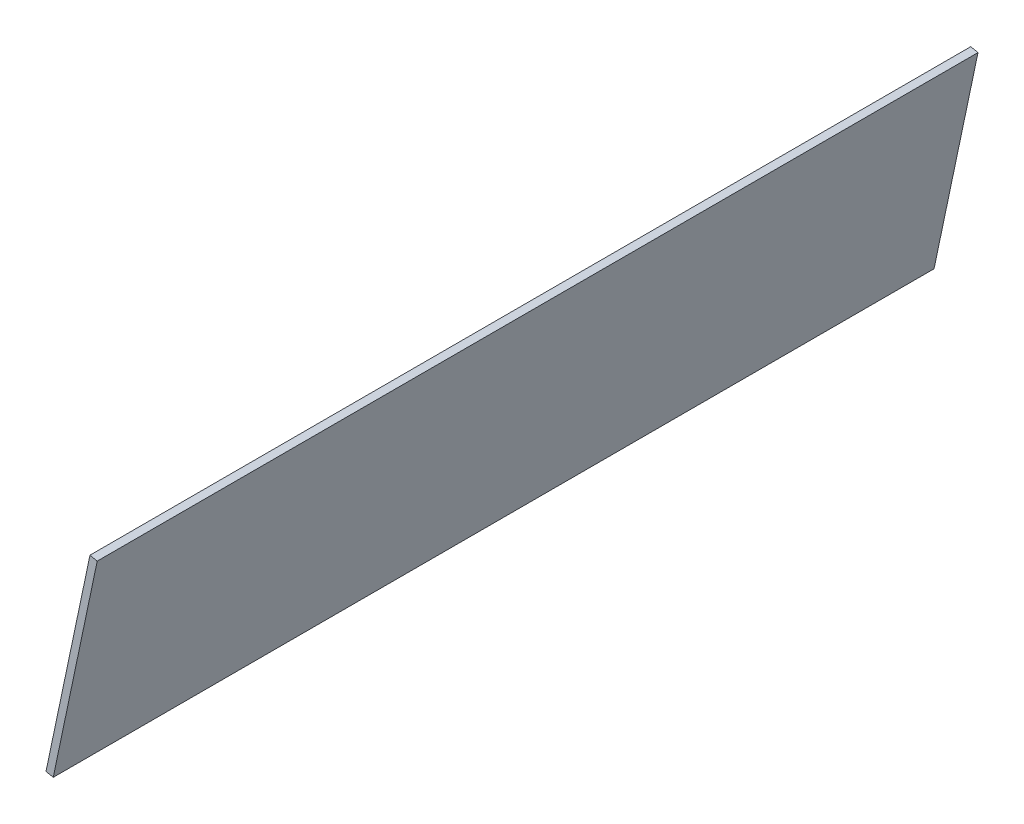
ISO-10303-21;
HEADER;
FILE_DESCRIPTION(('STEP AP214'),'2;1');
FILE_NAME('part.step','',(''),(''),'','','');
FILE_SCHEMA(('AUTOMOTIVE_DESIGN { 1 0 10303 214 1 1 1 1 }'));
ENDSEC;
DATA;
#1=APPLICATION_CONTEXT('core data for automotive mechanical design processes');
#2=APPLICATION_PROTOCOL_DEFINITION('international standard','automotive_design',2000,#1);
#3=PRODUCT_CONTEXT('',#1,'mechanical');
#4=PRODUCT('Part','Part','',(#3));
#5=PRODUCT_RELATED_PRODUCT_CATEGORY('part','',(#4));
#6=PRODUCT_DEFINITION_FORMATION('','',#4);
#7=PRODUCT_DEFINITION_CONTEXT('part definition',#1,'design');
#8=PRODUCT_DEFINITION('design','',#6,#7);
#9=PRODUCT_DEFINITION_SHAPE('','',#8);
#10=(LENGTH_UNIT() NAMED_UNIT(*) SI_UNIT(.MILLI.,.METRE.));
#11=(NAMED_UNIT(*) PLANE_ANGLE_UNIT() SI_UNIT($,.RADIAN.));
#12=(NAMED_UNIT(*) SI_UNIT($,.STERADIAN.) SOLID_ANGLE_UNIT());
#13=UNCERTAINTY_MEASURE_WITH_UNIT(LENGTH_MEASURE(1.E-05),#10,'distance_accuracy_value','');
#14=(GEOMETRIC_REPRESENTATION_CONTEXT(3) GLOBAL_UNCERTAINTY_ASSIGNED_CONTEXT((#13)) GLOBAL_UNIT_ASSIGNED_CONTEXT((#10,
#11,#12)) REPRESENTATION_CONTEXT('',''));
#15=CARTESIAN_POINT('',(0.,0.,0.));
#16=DIRECTION('',(0.,0.,1.));
#17=DIRECTION('',(1.,0.,0.));
#18=AXIS2_PLACEMENT_3D('',#15,#16,#17);
#19=CARTESIAN_POINT('',(0.,0.,0.));
#20=DIRECTION('',(0.,0.,1.));
#21=DIRECTION('',(1.,0.,0.));
#22=AXIS2_PLACEMENT_3D('',#19,#20,#21);
#23=PLANE('',#22);
#24=DIRECTION('',(0.978627227397066,-0.205642286014163,0.));
#25=VECTOR('',#24,1.);
#26=CARTESIAN_POINT('',(24.2240089882818,-184.530911804715,0.));
#27=LINE('',#26,#25);
#28=CARTESIAN_POINT('',(24.2240089882818,-184.530911804715,0.));
#29=VERTEX_POINT('',#28);
#30=CARTESIAN_POINT('',(27.4534788386921,-185.209531348562,0.));
#31=VERTEX_POINT('',#30);
#32=EDGE_CURVE('E85',#29,#31,#27,.T.);
#33=ORIENTED_EDGE('',*,*,#32,.F.);
#34=DIRECTION('',(-0.205642286014167,-0.978627227397065,0.));
#35=VECTOR('',#34,1.);
#36=CARTESIAN_POINT('',(24.2240089882818,-184.530911804715,0.));
#37=LINE('',#36,#35);
#38=CARTESIAN_POINT('',(43.8641091012227,-91.0660068386027,0.));
#39=VERTEX_POINT('',#38);
#40=EDGE_CURVE('E96',#39,#29,#37,.T.);
#41=ORIENTED_EDGE('',*,*,#40,.F.);
#42=DIRECTION('',(-0.978627227397067,0.205642286014161,0.));
#43=VECTOR('',#42,1.);
#44=CARTESIAN_POINT('',(47.0935789516329,-91.7446263824494,0.));
#45=LINE('',#44,#43);
#46=CARTESIAN_POINT('',(47.0935789516329,-91.7446263824494,0.));
#47=VERTEX_POINT('',#46);
#48=EDGE_CURVE('E87',#47,#39,#45,.T.);
#49=ORIENTED_EDGE('',*,*,#48,.F.);
#50=DIRECTION('',(0.205642286014166,0.978627227397065,0.));
#51=VECTOR('',#50,1.);
#52=CARTESIAN_POINT('',(27.4534788386921,-185.209531348562,0.));
#53=LINE('',#52,#51);
#54=EDGE_CURVE('E77',#31,#47,#53,.T.);
#55=ORIENTED_EDGE('',*,*,#54,.F.);
#56=EDGE_LOOP('',(#33,#41,#49,#55));
#57=FACE_BOUND('',#56,.T.);
#58=ADVANCED_FACE('F35',(#57),#23,.F.);
#59=CARTESIAN_POINT('',(24.2240089882818,-184.530911804715,490.281476234964));
#60=DIRECTION('',(0.978627227397066,-0.205642286014167,0.));
#61=DIRECTION('',(0.205642286014167,0.978627227397066,0.));
#62=AXIS2_PLACEMENT_3D('',#59,#60,#61);
#63=PLANE('',#62);
#64=DIRECTION('',(0.,0.,-1.));
#65=VECTOR('',#64,1.);
#66=CARTESIAN_POINT('',(24.2240089882818,-184.530911804715,490.281476234964));
#67=LINE('',#66,#65);
#68=CARTESIAN_POINT('',(24.2240089882818,-184.530911804715,393.4));
#69=VERTEX_POINT('',#68);
#70=EDGE_CURVE('E90',#69,#29,#67,.T.);
#71=ORIENTED_EDGE('',*,*,#70,.F.);
#72=DIRECTION('',(0.205642286014167,0.978627227397066,0.));
#73=VECTOR('',#72,1.);
#74=CARTESIAN_POINT('',(24.2240089882818,-184.530911804715,393.4));
#75=LINE('',#74,#73);
#76=CARTESIAN_POINT('',(43.8641091012227,-91.0660068386027,393.4));
#77=VERTEX_POINT('',#76);
#78=EDGE_CURVE('E39',#69,#77,#75,.T.);
#79=ORIENTED_EDGE('',*,*,#78,.T.);
#80=DIRECTION('',(0.,0.,-1.));
#81=VECTOR('',#80,1.);
#82=CARTESIAN_POINT('',(43.8641091012227,-91.0660068386027,490.281476234964));
#83=LINE('',#82,#81);
#84=EDGE_CURVE('E99',#77,#39,#83,.T.);
#85=ORIENTED_EDGE('',*,*,#84,.T.);
#86=ORIENTED_EDGE('',*,*,#40,.T.);
#87=EDGE_LOOP('',(#71,#79,#85,#86));
#88=FACE_BOUND('',#87,.T.);
#89=ADVANCED_FACE('F108',(#88),#63,.F.);
#90=CARTESIAN_POINT('',(47.0935789516329,-91.7446263824494,490.281476234964));
#91=DIRECTION('',(-0.205642286014161,-0.978627227397067,0.));
#92=DIRECTION('',(0.978627227397067,-0.205642286014161,0.));
#93=AXIS2_PLACEMENT_3D('',#90,#91,#92);
#94=PLANE('',#93);
#95=ORIENTED_EDGE('',*,*,#84,.F.);
#96=DIRECTION('',(0.978627227397067,-0.205642286014161,0.));
#97=VECTOR('',#96,1.);
#98=CARTESIAN_POINT('',(47.0935789516329,-91.7446263824494,393.4));
#99=LINE('',#98,#97);
#100=CARTESIAN_POINT('',(47.0935789516329,-91.7446263824494,393.4));
#101=VERTEX_POINT('',#100);
#102=EDGE_CURVE('E105',#77,#101,#99,.T.);
#103=ORIENTED_EDGE('',*,*,#102,.T.);
#104=DIRECTION('',(0.,0.,-1.));
#105=VECTOR('',#104,1.);
#106=CARTESIAN_POINT('',(47.0935789516329,-91.7446263824494,490.281476234964));
#107=LINE('',#106,#105);
#108=EDGE_CURVE('E81',#101,#47,#107,.T.);
#109=ORIENTED_EDGE('',*,*,#108,.T.);
#110=ORIENTED_EDGE('',*,*,#48,.T.);
#111=EDGE_LOOP('',(#95,#103,#109,#110));
#112=FACE_BOUND('',#111,.T.);
#113=ADVANCED_FACE('F104',(#112),#94,.F.);
#114=CARTESIAN_POINT('',(27.4534788386921,-185.209531348562,490.281476234964));
#115=DIRECTION('',(-0.978627227397066,0.205642286014166,0.));
#116=DIRECTION('',(-0.205642286014166,-0.978627227397066,0.));
#117=AXIS2_PLACEMENT_3D('',#114,#115,#116);
#118=PLANE('',#117);
#119=ORIENTED_EDGE('',*,*,#108,.F.);
#120=DIRECTION('',(-0.205642286014166,-0.978627227397066,0.));
#121=VECTOR('',#120,1.);
#122=CARTESIAN_POINT('',(27.4534788386921,-185.209531348562,393.4));
#123=LINE('',#122,#121);
#124=CARTESIAN_POINT('',(27.4534788386921,-185.209531348562,393.4));
#125=VERTEX_POINT('',#124);
#126=EDGE_CURVE('E44',#101,#125,#123,.T.);
#127=ORIENTED_EDGE('',*,*,#126,.T.);
#128=DIRECTION('',(0.,0.,-1.));
#129=VECTOR('',#128,1.);
#130=CARTESIAN_POINT('',(27.4534788386921,-185.209531348562,490.281476234964));
#131=LINE('',#130,#129);
#132=EDGE_CURVE('E74',#125,#31,#131,.T.);
#133=ORIENTED_EDGE('',*,*,#132,.T.);
#134=ORIENTED_EDGE('',*,*,#54,.T.);
#135=EDGE_LOOP('',(#119,#127,#133,#134));
#136=FACE_BOUND('',#135,.T.);
#137=ADVANCED_FACE('F76',(#136),#118,.F.);
#138=CARTESIAN_POINT('',(24.2240089882818,-184.530911804715,490.281476234964));
#139=DIRECTION('',(0.205642286014163,0.978627227397066,0.));
#140=DIRECTION('',(-0.978627227397066,0.205642286014163,0.));
#141=AXIS2_PLACEMENT_3D('',#138,#139,#140);
#142=PLANE('',#141);
#143=ORIENTED_EDGE('',*,*,#132,.F.);
#144=DIRECTION('',(-0.978627227397066,0.205642286014163,0.));
#145=VECTOR('',#144,1.);
#146=CARTESIAN_POINT('',(24.2240089882818,-184.530911804715,393.4));
#147=LINE('',#146,#145);
#148=EDGE_CURVE('E11',#125,#69,#147,.T.);
#149=ORIENTED_EDGE('',*,*,#148,.T.);
#150=ORIENTED_EDGE('',*,*,#70,.T.);
#151=ORIENTED_EDGE('',*,*,#32,.T.);
#152=EDGE_LOOP('',(#143,#149,#150,#151));
#153=FACE_BOUND('',#152,.T.);
#154=ADVANCED_FACE('F37',(#153),#142,.F.);
#155=CARTESIAN_POINT('',(-66.336454039562,-0.00346667706840106,393.4));
#156=DIRECTION('',(0.,0.,-1.));
#157=DIRECTION('',(-1.,0.,0.));
#158=AXIS2_PLACEMENT_3D('',#155,#156,#157);
#159=PLANE('',#158);
#160=ORIENTED_EDGE('',*,*,#126,.F.);
#161=ORIENTED_EDGE('',*,*,#102,.F.);
#162=ORIENTED_EDGE('',*,*,#78,.F.);
#163=ORIENTED_EDGE('',*,*,#148,.F.);
#164=EDGE_LOOP('',(#160,#161,#162,#163));
#165=FACE_BOUND('',#164,.T.);
#166=ADVANCED_FACE('F122',(#165),#159,.F.);
#167=CLOSED_SHELL('',(#58,#89,#113,#137,#154,#166));
#168=MANIFOLD_SOLID_BREP('B2',#167);
#169=ADVANCED_BREP_SHAPE_REPRESENTATION('',(#18,#168),#14);
#170=SHAPE_DEFINITION_REPRESENTATION(#9,#169);
ENDSEC;
END-ISO-10303-21;
